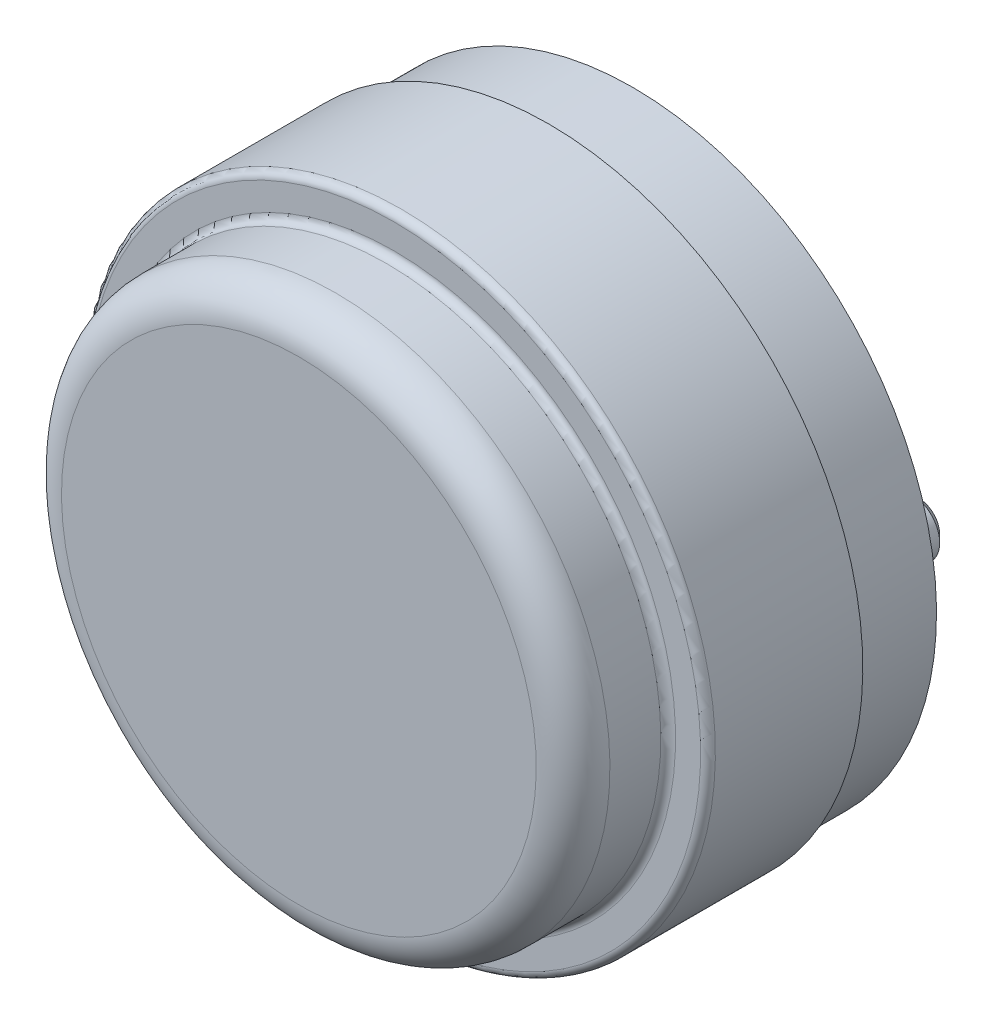
ISO-10303-21;
HEADER;
FILE_DESCRIPTION(('STEP AP214'),'2;1');
FILE_NAME('part.step','',(''),(''),'','','');
FILE_SCHEMA(('AUTOMOTIVE_DESIGN { 1 0 10303 214 1 1 1 1 }'));
ENDSEC;
DATA;
#1=APPLICATION_CONTEXT('core data for automotive mechanical design processes');
#2=APPLICATION_PROTOCOL_DEFINITION('international standard','automotive_design',2000,#1);
#3=PRODUCT_CONTEXT('',#1,'mechanical');
#4=PRODUCT('Part','Part','',(#3));
#5=PRODUCT_RELATED_PRODUCT_CATEGORY('part','',(#4));
#6=PRODUCT_DEFINITION_FORMATION('','',#4);
#7=PRODUCT_DEFINITION_CONTEXT('part definition',#1,'design');
#8=PRODUCT_DEFINITION('design','',#6,#7);
#9=PRODUCT_DEFINITION_SHAPE('','',#8);
#10=(LENGTH_UNIT() NAMED_UNIT(*) SI_UNIT(.MILLI.,.METRE.));
#11=(NAMED_UNIT(*) PLANE_ANGLE_UNIT() SI_UNIT($,.RADIAN.));
#12=(NAMED_UNIT(*) SI_UNIT($,.STERADIAN.) SOLID_ANGLE_UNIT());
#13=UNCERTAINTY_MEASURE_WITH_UNIT(LENGTH_MEASURE(1.E-05),#10,'distance_accuracy_value','');
#14=(GEOMETRIC_REPRESENTATION_CONTEXT(3) GLOBAL_UNCERTAINTY_ASSIGNED_CONTEXT((#13)) GLOBAL_UNIT_ASSIGNED_CONTEXT((#10,
#11,#12)) REPRESENTATION_CONTEXT('',''));
#15=CARTESIAN_POINT('',(0.,0.,0.));
#16=DIRECTION('',(0.,0.,1.));
#17=DIRECTION('',(1.,0.,0.));
#18=AXIS2_PLACEMENT_3D('',#15,#16,#17);
#19=CARTESIAN_POINT('',(0.,0.,7.62000000002265));
#20=DIRECTION('',(0.,0.,-1.));
#21=DIRECTION('',(0.,1.,0.));
#22=AXIS2_PLACEMENT_3D('',#19,#20,#21);
#23=PLANE('',#22);
#24=CARTESIAN_POINT('',(0.,0.,7.62000000002265));
#25=DIRECTION('',(0.,0.,-1.));
#26=DIRECTION('',(0.,1.,0.));
#27=AXIS2_PLACEMENT_3D('',#24,#25,#26);
#28=CIRCLE('',#27,5.08);
#29=CARTESIAN_POINT('',(0.,5.08,7.62000000002265));
#30=VERTEX_POINT('',#29);
#31=EDGE_CURVE('E60',#30,#30,#28,.T.);
#32=ORIENTED_EDGE('',*,*,#31,.T.);
#33=EDGE_LOOP('',(#32));
#34=FACE_BOUND('',#33,.T.);
#35=ADVANCED_FACE('F34',(#34),#23,.T.);
#36=CARTESIAN_POINT('',(0.,0.,0.));
#37=DIRECTION('',(0.,0.,-1.));
#38=DIRECTION('',(0.,1.,0.));
#39=AXIS2_PLACEMENT_3D('',#36,#37,#38);
#40=CYLINDRICAL_SURFACE('',#39,5.08);
#41=CARTESIAN_POINT('',(0.,0.,2.26539991139451E-11));
#42=DIRECTION('',(0.,0.,-1.));
#43=DIRECTION('',(0.,1.,0.));
#44=AXIS2_PLACEMENT_3D('',#41,#42,#43);
#45=CIRCLE('',#44,5.08);
#46=CARTESIAN_POINT('',(0.,5.08,2.26546212345191E-11));
#47=VERTEX_POINT('',#46);
#48=EDGE_CURVE('E63',#47,#47,#45,.T.);
#49=ORIENTED_EDGE('',*,*,#48,.T.);
#50=EDGE_LOOP('',(#49));
#51=FACE_BOUND('',#50,.T.);
#52=ORIENTED_EDGE('',*,*,#31,.F.);
#53=EDGE_LOOP('',(#52));
#54=FACE_BOUND('',#53,.T.);
#55=ADVANCED_FACE('F110',(#51,#54),#40,.F.);
#56=CARTESIAN_POINT('',(0.,5.08,2.26542915110506E-11));
#57=DIRECTION('',(0.,0.,-1.));
#58=DIRECTION('',(0.,1.,0.));
#59=AXIS2_PLACEMENT_3D('',#56,#57,#58);
#60=PLANE('',#59);
#61=CARTESIAN_POINT('',(-7.44220000000031,0.,2.26537538727811E-11));
#62=DIRECTION('',(0.,0.,-1.));
#63=DIRECTION('',(0.,1.,0.));
#64=AXIS2_PLACEMENT_3D('',#61,#62,#63);
#65=CIRCLE('',#64,0.97155);
#66=CARTESIAN_POINT('',(-7.44220000000031,0.97155,2.26538728533409E-11));
#67=VERTEX_POINT('',#66);
#68=EDGE_CURVE('E54',#67,#67,#65,.T.);
#69=ORIENTED_EDGE('',*,*,#68,.F.);
#70=EDGE_LOOP('',(#69));
#71=FACE_BOUND('',#70,.T.);
#72=CARTESIAN_POINT('',(7.44220000000031,0.,2.26537538727811E-11));
#73=DIRECTION('',(0.,0.,-1.));
#74=DIRECTION('',(0.,1.,0.));
#75=AXIS2_PLACEMENT_3D('',#72,#73,#74);
#76=CIRCLE('',#75,0.97155);
#77=CARTESIAN_POINT('',(7.44220000000031,0.97155,2.26538728533409E-11));
#78=VERTEX_POINT('',#77);
#79=EDGE_CURVE('E57',#78,#78,#76,.T.);
#80=ORIENTED_EDGE('',*,*,#79,.F.);
#81=EDGE_LOOP('',(#80));
#82=FACE_BOUND('',#81,.T.);
#83=CARTESIAN_POINT('',(0.,0.,2.26533396670082E-11));
#84=DIRECTION('',(0.,0.,-1.));
#85=DIRECTION('',(0.,1.,0.));
#86=AXIS2_PLACEMENT_3D('',#83,#84,#85);
#87=CIRCLE('',#86,10.4647928841899);
#88=CARTESIAN_POINT('',(0.,10.4647928841899,2.26546212345191E-11));
#89=VERTEX_POINT('',#88);
#90=EDGE_CURVE('E66',#89,#89,#87,.T.);
#91=ORIENTED_EDGE('',*,*,#90,.T.);
#92=EDGE_LOOP('',(#91));
#93=FACE_BOUND('',#92,.T.);
#94=ORIENTED_EDGE('',*,*,#48,.F.);
#95=EDGE_LOOP('',(#94));
#96=FACE_BOUND('',#95,.T.);
#97=ADVANCED_FACE('F116',(#71,#82,#93,#96),#60,.T.);
#98=CARTESIAN_POINT('',(0.,0.,0.));
#99=DIRECTION('',(0.,0.,-1.));
#100=DIRECTION('',(0.,1.,0.));
#101=AXIS2_PLACEMENT_3D('',#98,#99,#100);
#102=CYLINDRICAL_SURFACE('',#101,10.4647928841899);
#103=CARTESIAN_POINT('',(0.,0.,2.89559824733554));
#104=DIRECTION('',(0.,0.,-1.));
#105=DIRECTION('',(0.,1.,0.));
#106=AXIS2_PLACEMENT_3D('',#103,#104,#105);
#107=CIRCLE('',#106,10.4647928841899);
#108=CARTESIAN_POINT('',(0.,10.4647928841899,2.89559824733555));
#109=VERTEX_POINT('',#108);
#110=EDGE_CURVE('E69',#109,#109,#107,.T.);
#111=ORIENTED_EDGE('',*,*,#110,.T.);
#112=EDGE_LOOP('',(#111));
#113=FACE_BOUND('',#112,.T.);
#114=ORIENTED_EDGE('',*,*,#90,.F.);
#115=EDGE_LOOP('',(#114));
#116=FACE_BOUND('',#115,.T.);
#117=ADVANCED_FACE('F143',(#113,#116),#102,.T.);
#118=CARTESIAN_POINT('',(0.,10.4647928841899,2.89559824733555));
#119=DIRECTION('',(0.,0.,-1.));
#120=DIRECTION('',(0.,1.,0.));
#121=AXIS2_PLACEMENT_3D('',#118,#119,#120);
#122=PLANE('',#121);
#123=CARTESIAN_POINT('',(0.,0.,2.89559824733554));
#124=DIRECTION('',(0.,0.,-1.));
#125=DIRECTION('',(0.,1.,0.));
#126=AXIS2_PLACEMENT_3D('',#123,#124,#125);
#127=CIRCLE('',#126,10.8203928841899);
#128=CARTESIAN_POINT('',(0.,10.8203928841899,2.89559824733555));
#129=VERTEX_POINT('',#128);
#130=EDGE_CURVE('E72',#129,#129,#127,.T.);
#131=ORIENTED_EDGE('',*,*,#130,.T.);
#132=EDGE_LOOP('',(#131));
#133=FACE_BOUND('',#132,.T.);
#134=ORIENTED_EDGE('',*,*,#110,.F.);
#135=EDGE_LOOP('',(#134));
#136=FACE_BOUND('',#135,.T.);
#137=ADVANCED_FACE('F153',(#133,#136),#122,.T.);
#138=CARTESIAN_POINT('',(0.,0.,0.));
#139=DIRECTION('',(0.,0.,-1.));
#140=DIRECTION('',(0.,1.,0.));
#141=AXIS2_PLACEMENT_3D('',#138,#139,#140);
#142=CYLINDRICAL_SURFACE('',#141,10.8203928841899);
#143=CARTESIAN_POINT('',(0.,0.,7.97559824733555));
#144=DIRECTION('',(0.,0.,-1.));
#145=DIRECTION('',(0.,1.,0.));
#146=AXIS2_PLACEMENT_3D('',#143,#144,#145);
#147=CIRCLE('',#146,10.8203928841899);
#148=CARTESIAN_POINT('',(0.,10.8203928841899,7.97559824733555));
#149=VERTEX_POINT('',#148);
#150=EDGE_CURVE('E75',#149,#149,#147,.T.);
#151=ORIENTED_EDGE('',*,*,#150,.T.);
#152=EDGE_LOOP('',(#151));
#153=FACE_BOUND('',#152,.T.);
#154=ORIENTED_EDGE('',*,*,#130,.F.);
#155=EDGE_LOOP('',(#154));
#156=FACE_BOUND('',#155,.T.);
#157=ADVANCED_FACE('F159',(#153,#156),#142,.T.);
#158=CARTESIAN_POINT('',(0.,0.,7.97559824733555));
#159=DIRECTION('',(0.,0.,-1.));
#160=DIRECTION('',(0.,1.,0.));
#161=AXIS2_PLACEMENT_3D('',#158,#159,#160);
#162=TOROIDAL_SURFACE('',#161,10.5663928841899,0.253999999999999);
#163=CARTESIAN_POINT('',(0.,0.,8.22959824733555));
#164=DIRECTION('',(0.,0.,-1.));
#165=DIRECTION('',(0.,1.,0.));
#166=AXIS2_PLACEMENT_3D('',#163,#164,#165);
#167=CIRCLE('',#166,10.5663928841899);
#168=CARTESIAN_POINT('',(0.,10.5663928841899,8.22959824733555));
#169=VERTEX_POINT('',#168);
#170=EDGE_CURVE('E78',#169,#169,#167,.T.);
#171=ORIENTED_EDGE('',*,*,#170,.T.);
#172=EDGE_LOOP('',(#171));
#173=FACE_BOUND('',#172,.T.);
#174=ORIENTED_EDGE('',*,*,#150,.F.);
#175=EDGE_LOOP('',(#174));
#176=FACE_BOUND('',#175,.T.);
#177=ADVANCED_FACE('F165',(#173,#176),#162,.T.);
#178=CARTESIAN_POINT('',(0.,10.5663928841899,8.22959824733555));
#179=DIRECTION('',(0.,0.,1.));
#180=DIRECTION('',(0.,-1.,0.));
#181=AXIS2_PLACEMENT_3D('',#178,#179,#180);
#182=PLANE('',#181);
#183=CARTESIAN_POINT('',(0.,0.,8.22959824733555));
#184=DIRECTION('',(0.,0.,-1.));
#185=DIRECTION('',(0.,1.,0.));
#186=AXIS2_PLACEMENT_3D('',#183,#184,#185);
#187=CIRCLE('',#186,9.70279288418994);
#188=CARTESIAN_POINT('',(0.,9.70279288418993,8.22959824733555));
#189=VERTEX_POINT('',#188);
#190=EDGE_CURVE('E81',#189,#189,#187,.T.);
#191=ORIENTED_EDGE('',*,*,#190,.T.);
#192=EDGE_LOOP('',(#191));
#193=FACE_BOUND('',#192,.T.);
#194=ORIENTED_EDGE('',*,*,#170,.F.);
#195=EDGE_LOOP('',(#194));
#196=FACE_BOUND('',#195,.T.);
#197=ADVANCED_FACE('F169',(#193,#196),#182,.T.);
#198=CARTESIAN_POINT('',(0.,0.,8.48359824733555));
#199=DIRECTION('',(0.,0.,-1.));
#200=DIRECTION('',(0.,1.,0.));
#201=AXIS2_PLACEMENT_3D('',#198,#199,#200);
#202=TOROIDAL_SURFACE('',#201,9.70279288418994,0.254000000000001);
#203=CARTESIAN_POINT('',(0.,0.,8.48359824733555));
#204=DIRECTION('',(0.,0.,-1.));
#205=DIRECTION('',(0.,1.,0.));
#206=AXIS2_PLACEMENT_3D('',#203,#204,#205);
#207=CIRCLE('',#206,9.44879288418994);
#208=CARTESIAN_POINT('',(0.,9.44879288418993,8.48359824733555));
#209=VERTEX_POINT('',#208);
#210=EDGE_CURVE('E84',#209,#209,#207,.T.);
#211=ORIENTED_EDGE('',*,*,#210,.T.);
#212=EDGE_LOOP('',(#211));
#213=FACE_BOUND('',#212,.T.);
#214=ORIENTED_EDGE('',*,*,#190,.F.);
#215=EDGE_LOOP('',(#214));
#216=FACE_BOUND('',#215,.T.);
#217=ADVANCED_FACE('F173',(#213,#216),#202,.F.);
#218=CARTESIAN_POINT('',(0.,0.,0.));
#219=DIRECTION('',(0.,0.,-1.));
#220=DIRECTION('',(0.,1.,0.));
#221=AXIS2_PLACEMENT_3D('',#218,#219,#220);
#222=CYLINDRICAL_SURFACE('',#221,9.44879288418994);
#223=CARTESIAN_POINT('',(0.,0.,10.2362000000037));
#224=DIRECTION('',(0.,0.,-1.));
#225=DIRECTION('',(0.,1.,0.));
#226=AXIS2_PLACEMENT_3D('',#223,#224,#225);
#227=CIRCLE('',#226,9.44879288418994);
#228=CARTESIAN_POINT('',(0.,9.44879288418993,10.2362000000037));
#229=VERTEX_POINT('',#228);
#230=EDGE_CURVE('E87',#229,#229,#227,.T.);
#231=ORIENTED_EDGE('',*,*,#230,.T.);
#232=EDGE_LOOP('',(#231));
#233=FACE_BOUND('',#232,.T.);
#234=ORIENTED_EDGE('',*,*,#210,.F.);
#235=EDGE_LOOP('',(#234));
#236=FACE_BOUND('',#235,.T.);
#237=ADVANCED_FACE('F107',(#233,#236),#222,.T.);
#238=CARTESIAN_POINT('',(0.,0.,10.2362000000037));
#239=DIRECTION('',(0.,0.,-1.));
#240=DIRECTION('',(0.,1.,0.));
#241=AXIS2_PLACEMENT_3D('',#238,#239,#240);
#242=TOROIDAL_SURFACE('',#241,8.17879288418993,1.27);
#243=CARTESIAN_POINT('',(0.,0.,11.5062000000037));
#244=DIRECTION('',(0.,0.,-1.));
#245=DIRECTION('',(0.,1.,0.));
#246=AXIS2_PLACEMENT_3D('',#243,#244,#245);
#247=CIRCLE('',#246,8.17879288418993);
#248=CARTESIAN_POINT('',(0.,8.17879288418993,11.5062000000037));
#249=VERTEX_POINT('',#248);
#250=EDGE_CURVE('E90',#249,#249,#247,.T.);
#251=ORIENTED_EDGE('',*,*,#250,.T.);
#252=EDGE_LOOP('',(#251));
#253=FACE_BOUND('',#252,.T.);
#254=ORIENTED_EDGE('',*,*,#230,.F.);
#255=EDGE_LOOP('',(#254));
#256=FACE_BOUND('',#255,.T.);
#257=ADVANCED_FACE('F94',(#253,#256),#242,.T.);
#258=CARTESIAN_POINT('',(0.,8.17879288418993,11.5062000000037));
#259=DIRECTION('',(0.,0.,1.));
#260=DIRECTION('',(0.,-1.,0.));
#261=AXIS2_PLACEMENT_3D('',#258,#259,#260);
#262=PLANE('',#261);
#263=ORIENTED_EDGE('',*,*,#250,.F.);
#264=EDGE_LOOP('',(#263));
#265=FACE_BOUND('',#264,.T.);
#266=ADVANCED_FACE('F97',(#265),#262,.T.);
#267=CARTESIAN_POINT('',(7.44220000000031,0.,-2.41));
#268=DIRECTION('',(0.,0.,1.));
#269=DIRECTION('',(1.,0.,0.));
#270=AXIS2_PLACEMENT_3D('',#267,#268,#269);
#271=CYLINDRICAL_SURFACE('',#270,0.97155);
#272=CARTESIAN_POINT('',(7.44220000000031,0.,-2.16000000000001));
#273=DIRECTION('',(0.,0.,1.));
#274=DIRECTION('',(1.,0.,0.));
#275=AXIS2_PLACEMENT_3D('',#272,#273,#274);
#276=CIRCLE('',#275,0.97155);
#277=CARTESIAN_POINT('',(8.41375000000031,0.,-2.16000000000001));
#278=VERTEX_POINT('',#277);
#279=EDGE_CURVE('E41',#278,#278,#276,.T.);
#280=ORIENTED_EDGE('',*,*,#279,.T.);
#281=EDGE_LOOP('',(#280));
#282=FACE_BOUND('',#281,.T.);
#283=ORIENTED_EDGE('',*,*,#79,.T.);
#284=EDGE_LOOP('',(#283));
#285=FACE_BOUND('',#284,.T.);
#286=ADVANCED_FACE('F99',(#282,#285),#271,.T.);
#287=CARTESIAN_POINT('',(7.44220000000031,0.,-2.41));
#288=DIRECTION('',(0.,0.,1.));
#289=DIRECTION('',(1.,0.,0.));
#290=AXIS2_PLACEMENT_3D('',#287,#288,#289);
#291=PLANE('',#290);
#292=CARTESIAN_POINT('',(7.44220000000031,0.,-2.41));
#293=DIRECTION('',(0.,0.,1.));
#294=DIRECTION('',(1.,0.,0.));
#295=AXIS2_PLACEMENT_3D('',#292,#293,#294);
#296=CIRCLE('',#295,0.721550000000005);
#297=CARTESIAN_POINT('',(8.16375000000031,0.,-2.41));
#298=VERTEX_POINT('',#297);
#299=EDGE_CURVE('E10',#298,#298,#296,.F.);
#300=ORIENTED_EDGE('',*,*,#299,.T.);
#301=EDGE_LOOP('',(#300));
#302=FACE_BOUND('',#301,.T.);
#303=ADVANCED_FACE('F105',(#302),#291,.F.);
#304=CARTESIAN_POINT('',(-7.44220000000031,0.,-2.41));
#305=DIRECTION('',(0.,0.,1.));
#306=DIRECTION('',(1.,0.,0.));
#307=AXIS2_PLACEMENT_3D('',#304,#305,#306);
#308=CYLINDRICAL_SURFACE('',#307,0.97155);
#309=CARTESIAN_POINT('',(-7.44220000000031,0.,-2.16000000000001));
#310=DIRECTION('',(0.,0.,-1.));
#311=DIRECTION('',(-1.,0.,0.));
#312=AXIS2_PLACEMENT_3D('',#309,#310,#311);
#313=CIRCLE('',#312,0.97155);
#314=CARTESIAN_POINT('',(-8.41375000000031,0.,-2.16000000000001));
#315=VERTEX_POINT('',#314);
#316=EDGE_CURVE('E49',#315,#315,#313,.F.);
#317=ORIENTED_EDGE('',*,*,#316,.T.);
#318=EDGE_LOOP('',(#317));
#319=FACE_BOUND('',#318,.T.);
#320=ORIENTED_EDGE('',*,*,#68,.T.);
#321=EDGE_LOOP('',(#320));
#322=FACE_BOUND('',#321,.T.);
#323=ADVANCED_FACE('F129',(#319,#322),#308,.T.);
#324=CARTESIAN_POINT('',(-7.44220000000031,0.,-2.41));
#325=DIRECTION('',(0.,0.,-1.));
#326=DIRECTION('',(-1.,0.,0.));
#327=AXIS2_PLACEMENT_3D('',#324,#325,#326);
#328=PLANE('',#327);
#329=CARTESIAN_POINT('',(-7.44220000000031,0.,-2.41));
#330=DIRECTION('',(0.,0.,-1.));
#331=DIRECTION('',(-1.,0.,0.));
#332=AXIS2_PLACEMENT_3D('',#329,#330,#331);
#333=CIRCLE('',#332,0.721550000000005);
#334=CARTESIAN_POINT('',(-8.16375000000031,0.,-2.41));
#335=VERTEX_POINT('',#334);
#336=EDGE_CURVE('E45',#335,#335,#333,.T.);
#337=ORIENTED_EDGE('',*,*,#336,.T.);
#338=EDGE_LOOP('',(#337));
#339=FACE_BOUND('',#338,.T.);
#340=ADVANCED_FACE('F122',(#339),#328,.T.);
#341=CARTESIAN_POINT('',(-7.44220000000031,0.,-2.16000000000001));
#342=DIRECTION('',(0.,0.,1.));
#343=DIRECTION('',(1.,0.,0.));
#344=AXIS2_PLACEMENT_3D('',#341,#342,#343);
#345=CONICAL_SURFACE('',#344,0.97155,0.785398163397455);
#346=ORIENTED_EDGE('',*,*,#336,.F.);
#347=EDGE_LOOP('',(#346));
#348=FACE_BOUND('',#347,.T.);
#349=ORIENTED_EDGE('',*,*,#316,.F.);
#350=EDGE_LOOP('',(#349));
#351=FACE_BOUND('',#350,.T.);
#352=ADVANCED_FACE('F120',(#348,#351),#345,.T.);
#353=CARTESIAN_POINT('',(7.44220000000031,0.,-2.16000000000001));
#354=DIRECTION('',(0.,0.,1.));
#355=DIRECTION('',(1.,0.,0.));
#356=AXIS2_PLACEMENT_3D('',#353,#354,#355);
#357=CONICAL_SURFACE('',#356,0.97155,0.785398163397455);
#358=ORIENTED_EDGE('',*,*,#299,.F.);
#359=EDGE_LOOP('',(#358));
#360=FACE_BOUND('',#359,.T.);
#361=ORIENTED_EDGE('',*,*,#279,.F.);
#362=EDGE_LOOP('',(#361));
#363=FACE_BOUND('',#362,.T.);
#364=ADVANCED_FACE('F36',(#360,#363),#357,.T.);
#365=CLOSED_SHELL('',(#35,#55,#97,#117,#137,#157,#177,#197,#217,#237,#257,#266,#286,#303,#323,
#340,#352,#364));
#366=MANIFOLD_SOLID_BREP('B2',#365);
#367=ADVANCED_BREP_SHAPE_REPRESENTATION('',(#18,#366),#14);
#368=SHAPE_DEFINITION_REPRESENTATION(#9,#367);
ENDSEC;
END-ISO-10303-21;
